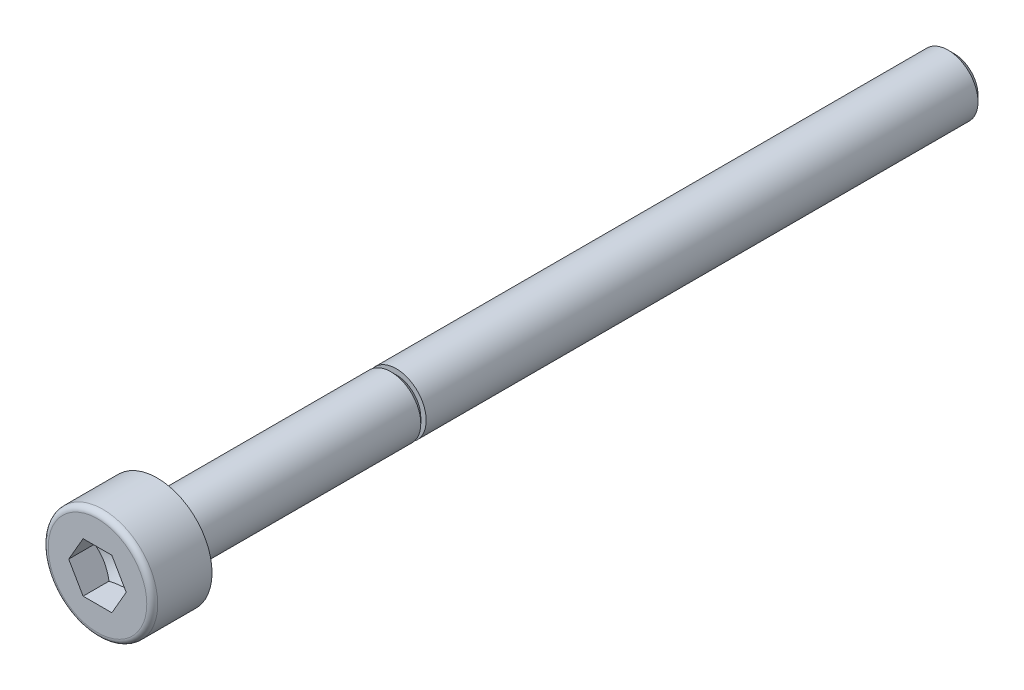
ISO-10303-21;
HEADER;
FILE_DESCRIPTION(('STEP AP214'),'2;1');
FILE_NAME('part.step','',(''),(''),'','','');
FILE_SCHEMA(('AUTOMOTIVE_DESIGN { 1 0 10303 214 1 1 1 1 }'));
ENDSEC;
DATA;
#1=APPLICATION_CONTEXT('core data for automotive mechanical design processes');
#2=APPLICATION_PROTOCOL_DEFINITION('international standard','automotive_design',2000,#1);
#3=PRODUCT_CONTEXT('',#1,'mechanical');
#4=PRODUCT('Part','Part','',(#3));
#5=PRODUCT_RELATED_PRODUCT_CATEGORY('part','',(#4));
#6=PRODUCT_DEFINITION_FORMATION('','',#4);
#7=PRODUCT_DEFINITION_CONTEXT('part definition',#1,'design');
#8=PRODUCT_DEFINITION('design','',#6,#7);
#9=PRODUCT_DEFINITION_SHAPE('','',#8);
#10=(LENGTH_UNIT() NAMED_UNIT(*) SI_UNIT(.MILLI.,.METRE.));
#11=(NAMED_UNIT(*) PLANE_ANGLE_UNIT() SI_UNIT($,.RADIAN.));
#12=(NAMED_UNIT(*) SI_UNIT($,.STERADIAN.) SOLID_ANGLE_UNIT());
#13=UNCERTAINTY_MEASURE_WITH_UNIT(LENGTH_MEASURE(1.E-05),#10,'distance_accuracy_value','');
#14=(GEOMETRIC_REPRESENTATION_CONTEXT(3) GLOBAL_UNCERTAINTY_ASSIGNED_CONTEXT((#13)) GLOBAL_UNIT_ASSIGNED_CONTEXT((#10,
#11,#12)) REPRESENTATION_CONTEXT('',''));
#15=CARTESIAN_POINT('',(0.,0.,0.));
#16=DIRECTION('',(0.,0.,1.));
#17=DIRECTION('',(1.,0.,0.));
#18=AXIS2_PLACEMENT_3D('',#15,#16,#17);
#19=CARTESIAN_POINT('',(0.,2.475,3.));
#20=DIRECTION('',(0.,0.,-1.));
#21=DIRECTION('',(-1.,0.,0.));
#22=AXIS2_PLACEMENT_3D('',#19,#20,#21);
#23=PLANE('',#22);
#24=CARTESIAN_POINT('',(0.,0.,3.));
#25=DIRECTION('',(0.,0.,1.));
#26=DIRECTION('',(1.,0.,0.));
#27=AXIS2_PLACEMENT_3D('',#24,#25,#26);
#28=CIRCLE('',#27,2.475);
#29=CARTESIAN_POINT('',(2.475,0.,3.));
#30=VERTEX_POINT('',#29);
#31=EDGE_CURVE('E148',#30,#30,#28,.T.);
#32=ORIENTED_EDGE('',*,*,#31,.T.);
#33=EDGE_LOOP('',(#32));
#34=FACE_BOUND('',#33,.T.);
#35=DIRECTION('',(0.5,-0.866025403784439,0.));
#36=VECTOR('',#35,1.);
#37=CARTESIAN_POINT('',(0.7216875,1.24999941718736,3.));
#38=LINE('',#37,#36);
#39=CARTESIAN_POINT('',(0.7216875,1.24999941718736,3.));
#40=VERTEX_POINT('',#39);
#41=CARTESIAN_POINT('',(1.443375,0.,3.));
#42=VERTEX_POINT('',#41);
#43=EDGE_CURVE('E50',#40,#42,#38,.T.);
#44=ORIENTED_EDGE('',*,*,#43,.T.);
#45=DIRECTION('',(-0.5,-0.866025403784439,0.));
#46=VECTOR('',#45,1.);
#47=CARTESIAN_POINT('',(1.443375,0.,3.));
#48=LINE('',#47,#46);
#49=CARTESIAN_POINT('',(0.7216875,-1.24999941718736,3.));
#50=VERTEX_POINT('',#49);
#51=EDGE_CURVE('E224',#42,#50,#48,.T.);
#52=ORIENTED_EDGE('',*,*,#51,.T.);
#53=DIRECTION('',(-1.,0.,0.));
#54=VECTOR('',#53,1.);
#55=CARTESIAN_POINT('',(0.7216875,-1.24999941718736,3.));
#56=LINE('',#55,#54);
#57=CARTESIAN_POINT('',(-0.7216875,-1.24999941718736,3.));
#58=VERTEX_POINT('',#57);
#59=EDGE_CURVE('E278',#50,#58,#56,.T.);
#60=ORIENTED_EDGE('',*,*,#59,.T.);
#61=DIRECTION('',(-0.5,0.866025403784439,0.));
#62=VECTOR('',#61,1.);
#63=CARTESIAN_POINT('',(-0.7216875,-1.24999941718736,3.));
#64=LINE('',#63,#62);
#65=CARTESIAN_POINT('',(-1.443375,0.,3.));
#66=VERTEX_POINT('',#65);
#67=EDGE_CURVE('E273',#58,#66,#64,.T.);
#68=ORIENTED_EDGE('',*,*,#67,.T.);
#69=DIRECTION('',(0.5,0.866025403784439,0.));
#70=VECTOR('',#69,1.);
#71=CARTESIAN_POINT('',(-1.443375,0.,3.));
#72=LINE('',#71,#70);
#73=CARTESIAN_POINT('',(-0.7216875,1.24999941718736,3.));
#74=VERTEX_POINT('',#73);
#75=EDGE_CURVE('E122',#66,#74,#72,.T.);
#76=ORIENTED_EDGE('',*,*,#75,.T.);
#77=DIRECTION('',(1.,0.,0.));
#78=VECTOR('',#77,1.);
#79=CARTESIAN_POINT('',(-0.7216875,1.24999941718736,3.));
#80=LINE('',#79,#78);
#81=EDGE_CURVE('E114',#74,#40,#80,.T.);
#82=ORIENTED_EDGE('',*,*,#81,.T.);
#83=EDGE_LOOP('',(#44,#52,#60,#68,#76,#82));
#84=FACE_BOUND('',#83,.T.);
#85=ADVANCED_FACE('F35',(#34,#84),#23,.F.);
#86=CARTESIAN_POINT('',(0.,0.,0.));
#87=DIRECTION('',(0.,0.,1.));
#88=DIRECTION('',(1.,0.,0.));
#89=AXIS2_PLACEMENT_3D('',#86,#87,#88);
#90=PLANE('',#89);
#91=CARTESIAN_POINT('',(0.,0.,0.));
#92=DIRECTION('',(0.,0.,1.));
#93=DIRECTION('',(1.,0.,0.));
#94=AXIS2_PLACEMENT_3D('',#91,#92,#93);
#95=CIRCLE('',#94,2.75);
#96=CARTESIAN_POINT('',(2.75,0.,0.));
#97=VERTEX_POINT('',#96);
#98=EDGE_CURVE('E156',#97,#97,#95,.T.);
#99=ORIENTED_EDGE('',*,*,#98,.F.);
#100=EDGE_LOOP('',(#99));
#101=FACE_BOUND('',#100,.T.);
#102=CARTESIAN_POINT('',(0.,0.,0.));
#103=DIRECTION('',(0.,0.,1.));
#104=DIRECTION('',(1.,0.,0.));
#105=AXIS2_PLACEMENT_3D('',#102,#103,#104);
#106=CIRCLE('',#105,1.5);
#107=CARTESIAN_POINT('',(1.5,0.,0.));
#108=VERTEX_POINT('',#107);
#109=EDGE_CURVE('E160',#108,#108,#106,.F.);
#110=ORIENTED_EDGE('',*,*,#109,.F.);
#111=EDGE_LOOP('',(#110));
#112=FACE_BOUND('',#111,.T.);
#113=ADVANCED_FACE('F178',(#101,#112),#90,.F.);
#114=CARTESIAN_POINT('',(0.,0.,3.));
#115=DIRECTION('',(0.,0.,1.));
#116=DIRECTION('',(1.,0.,0.));
#117=AXIS2_PLACEMENT_3D('',#114,#115,#116);
#118=CYLINDRICAL_SURFACE('',#117,2.75);
#119=CARTESIAN_POINT('',(0.,0.,2.725));
#120=DIRECTION('',(0.,0.,1.));
#121=DIRECTION('',(1.,0.,0.));
#122=AXIS2_PLACEMENT_3D('',#119,#120,#121);
#123=CIRCLE('',#122,2.75);
#124=CARTESIAN_POINT('',(2.75,0.,2.725));
#125=VERTEX_POINT('',#124);
#126=EDGE_CURVE('E152',#125,#125,#123,.T.);
#127=ORIENTED_EDGE('',*,*,#126,.F.);
#128=EDGE_LOOP('',(#127));
#129=FACE_BOUND('',#128,.T.);
#130=ORIENTED_EDGE('',*,*,#98,.T.);
#131=EDGE_LOOP('',(#130));
#132=FACE_BOUND('',#131,.T.);
#133=ADVANCED_FACE('F183',(#129,#132),#118,.T.);
#134=CARTESIAN_POINT('',(0.,0.,2.725));
#135=DIRECTION('',(0.,0.,1.));
#136=DIRECTION('',(1.,0.,0.));
#137=AXIS2_PLACEMENT_3D('',#134,#135,#136);
#138=TOROIDAL_SURFACE('',#137,2.475,0.275);
#139=ORIENTED_EDGE('',*,*,#31,.F.);
#140=EDGE_LOOP('',(#139));
#141=FACE_BOUND('',#140,.T.);
#142=ORIENTED_EDGE('',*,*,#126,.T.);
#143=EDGE_LOOP('',(#142));
#144=FACE_BOUND('',#143,.T.);
#145=ADVANCED_FACE('F190',(#141,#144),#138,.T.);
#146=CARTESIAN_POINT('',(0.,0.,0.));
#147=DIRECTION('',(0.,0.,1.));
#148=DIRECTION('',(1.,0.,0.));
#149=AXIS2_PLACEMENT_3D('',#146,#147,#148);
#150=CYLINDRICAL_SURFACE('',#149,1.5);
#151=CARTESIAN_POINT('',(0.,0.,-11.729375));
#152=DIRECTION('',(0.,0.,1.));
#153=DIRECTION('',(1.,0.,0.));
#154=AXIS2_PLACEMENT_3D('',#151,#152,#153);
#155=CIRCLE('',#154,1.5);
#156=CARTESIAN_POINT('',(1.5,0.,-11.729375));
#157=VERTEX_POINT('',#156);
#158=EDGE_CURVE('E136',#157,#157,#155,.T.);
#159=ORIENTED_EDGE('',*,*,#158,.T.);
#160=EDGE_LOOP('',(#159));
#161=FACE_BOUND('',#160,.T.);
#162=ORIENTED_EDGE('',*,*,#109,.T.);
#163=EDGE_LOOP('',(#162));
#164=FACE_BOUND('',#163,.T.);
#165=ADVANCED_FACE('F194',(#161,#164),#150,.T.);
#166=CARTESIAN_POINT('',(0.,0.,0.));
#167=DIRECTION('',(0.,0.,1.));
#168=DIRECTION('',(1.,0.,0.));
#169=AXIS2_PLACEMENT_3D('',#166,#167,#168);
#170=CYLINDRICAL_SURFACE('',#169,1.5);
#171=CARTESIAN_POINT('',(0.,0.,-39.7));
#172=DIRECTION('',(0.,0.,1.));
#173=DIRECTION('',(1.,0.,0.));
#174=AXIS2_PLACEMENT_3D('',#171,#172,#173);
#175=CIRCLE('',#174,1.5);
#176=CARTESIAN_POINT('',(1.5,0.,-39.7));
#177=VERTEX_POINT('',#176);
#178=EDGE_CURVE('E43',#177,#177,#175,.T.);
#179=ORIENTED_EDGE('',*,*,#178,.T.);
#180=EDGE_LOOP('',(#179));
#181=FACE_BOUND('',#180,.T.);
#182=CARTESIAN_POINT('',(0.,0.,-12.));
#183=DIRECTION('',(0.,0.,1.));
#184=DIRECTION('',(1.,0.,0.));
#185=AXIS2_PLACEMENT_3D('',#182,#183,#184);
#186=CIRCLE('',#185,1.5);
#187=CARTESIAN_POINT('',(1.5,0.,-12.));
#188=VERTEX_POINT('',#187);
#189=EDGE_CURVE('E144',#188,#188,#186,.T.);
#190=ORIENTED_EDGE('',*,*,#189,.F.);
#191=EDGE_LOOP('',(#190));
#192=FACE_BOUND('',#191,.T.);
#193=ADVANCED_FACE('F166',(#181,#192),#170,.T.);
#194=CARTESIAN_POINT('',(0.,1.5,-12.));
#195=DIRECTION('',(0.,0.,-1.));
#196=DIRECTION('',(-1.,0.,0.));
#197=AXIS2_PLACEMENT_3D('',#194,#195,#196);
#198=PLANE('',#197);
#199=CARTESIAN_POINT('',(0.,0.,-12.));
#200=DIRECTION('',(0.,0.,1.));
#201=DIRECTION('',(1.,0.,0.));
#202=AXIS2_PLACEMENT_3D('',#199,#200,#201);
#203=CIRCLE('',#202,1.229375);
#204=CARTESIAN_POINT('',(1.229375,0.,-12.));
#205=VERTEX_POINT('',#204);
#206=EDGE_CURVE('E140',#205,#205,#203,.T.);
#207=ORIENTED_EDGE('',*,*,#206,.F.);
#208=EDGE_LOOP('',(#207));
#209=FACE_BOUND('',#208,.T.);
#210=ORIENTED_EDGE('',*,*,#189,.T.);
#211=EDGE_LOOP('',(#210));
#212=FACE_BOUND('',#211,.T.);
#213=ADVANCED_FACE('F198',(#209,#212),#198,.F.);
#214=CARTESIAN_POINT('',(0.,0.,-12.));
#215=DIRECTION('',(0.,0.,1.));
#216=DIRECTION('',(1.,0.,0.));
#217=AXIS2_PLACEMENT_3D('',#214,#215,#216);
#218=CONICAL_SURFACE('',#217,1.229375,0.785398163397449);
#219=ORIENTED_EDGE('',*,*,#158,.F.);
#220=EDGE_LOOP('',(#219));
#221=FACE_BOUND('',#220,.T.);
#222=ORIENTED_EDGE('',*,*,#206,.T.);
#223=EDGE_LOOP('',(#222));
#224=FACE_BOUND('',#223,.T.);
#225=ADVANCED_FACE('F201',(#221,#224),#218,.T.);
#226=CARTESIAN_POINT('',(0.7216875,1.24999941718736,0.866667055208424));
#227=DIRECTION('',(-0.866025403784439,-0.5,0.));
#228=DIRECTION('',(-0.5,0.866025403784439,0.));
#229=AXIS2_PLACEMENT_3D('',#226,#227,#228);
#230=PLANE('',#229);
#231=DIRECTION('',(0.,0.,1.));
#232=VECTOR('',#231,1.);
#233=CARTESIAN_POINT('',(1.443375,0.,0.866667055208424));
#234=LINE('',#233,#232);
#235=CARTESIAN_POINT('',(1.443375,0.,1.7));
#236=VERTEX_POINT('',#235);
#237=EDGE_CURVE('E134',#236,#42,#234,.T.);
#238=ORIENTED_EDGE('',*,*,#237,.T.);
#239=ORIENTED_EDGE('',*,*,#43,.F.);
#240=DIRECTION('',(0.,0.,1.));
#241=VECTOR('',#240,1.);
#242=CARTESIAN_POINT('',(0.7216875,1.24999941718736,0.866667055208424));
#243=LINE('',#242,#241);
#244=CARTESIAN_POINT('',(0.7216875,1.24999941718736,1.7));
#245=VERTEX_POINT('',#244);
#246=EDGE_CURVE('E107',#245,#40,#243,.T.);
#247=ORIENTED_EDGE('',*,*,#246,.F.);
#248=CARTESIAN_POINT('',(1.44337615470054,-2.E-06,1.70000066666746));
#249=CARTESIAN_POINT('',(1.41166234028678,0.0549279378664336,1.68168533615401));
#250=CARTESIAN_POINT('',(1.37967477272109,0.110332030100754,1.665028493242));
#251=CARTESIAN_POINT('',(1.31514579266581,0.222099502117096,1.63595445502155));
#252=CARTESIAN_POINT('',(1.28260323398259,0.278464867164723,1.62354754391631));
#253=CARTESIAN_POINT('',(1.2179214008177,0.39049708853301,1.60423526604097));
#254=CARTESIAN_POINT('',(1.18579207575664,0.446146711951657,1.59720135081684));
#255=CARTESIAN_POINT('',(1.12138232312734,0.557707676008561,1.58880584887112));
#256=CARTESIAN_POINT('',(1.08910212951503,0.613618611423235,1.5874373083282));
#257=CARTESIAN_POINT('',(1.02878989848834,0.718082459879303,1.59029140151107));
#258=CARTESIAN_POINT('',(1.00074881136366,0.766651047478699,1.59381326069777));
#259=CARTESIAN_POINT('',(0.94484931590916,0.863471813723365,1.60497329524828));
#260=CARTESIAN_POINT('',(0.916991100780736,0.91172365773398,1.61261527923588));
#261=CARTESIAN_POINT('',(0.860976444321451,1.00874388868998,1.63171878575366));
#262=CARTESIAN_POINT('',(0.832827088932361,1.0575000024242,1.64326125012845));
#263=CARTESIAN_POINT('',(0.776948107685497,1.15428523701895,1.6694577743606));
#264=CARTESIAN_POINT('',(0.749217766489108,1.20231559688232,1.68410568290989));
#265=CARTESIAN_POINT('',(0.721686345299461,1.25000141718736,1.70000066666746));
#266=B_SPLINE_CURVE_WITH_KNOTS('',3,(#248,#249,#250,#251,#252,#253,#254,#255,#256,#257,#258,
#259,#260,#261,#262,#263,#264,#265),.UNSPECIFIED.,.F.,.F.,(4,2,2,2,2,2,2,2,4),(0.,
0.198135072963001,0.396746271230005,0.590442442133857,0.783900794935013,0.952318546997791,
1.12089225123217,1.29320414395206,1.46517785562982),.UNSPECIFIED.);
#267=EDGE_CURVE('E99',#236,#245,#266,.T.);
#268=ORIENTED_EDGE('',*,*,#267,.F.);
#269=EDGE_LOOP('',(#238,#239,#247,#268));
#270=FACE_BOUND('',#269,.T.);
#271=ADVANCED_FACE('F108',(#270),#230,.T.);
#272=CARTESIAN_POINT('',(1.443375,0.,0.866667055208424));
#273=DIRECTION('',(-0.866025403784439,0.5,0.));
#274=DIRECTION('',(0.5,0.866025403784439,0.));
#275=AXIS2_PLACEMENT_3D('',#272,#273,#274);
#276=PLANE('',#275);
#277=DIRECTION('',(0.,0.,1.));
#278=VECTOR('',#277,1.);
#279=CARTESIAN_POINT('',(0.7216875,-1.24999941718736,0.866667055208424));
#280=LINE('',#279,#278);
#281=CARTESIAN_POINT('',(0.7216875,-1.24999941718736,1.7));
#282=VERTEX_POINT('',#281);
#283=EDGE_CURVE('E131',#282,#50,#280,.T.);
#284=ORIENTED_EDGE('',*,*,#283,.T.);
#285=ORIENTED_EDGE('',*,*,#51,.F.);
#286=ORIENTED_EDGE('',*,*,#237,.F.);
#287=CARTESIAN_POINT('',(0.721686345299462,-1.25000141718736,1.70000066666746));
#288=CARTESIAN_POINT('',(0.753400159713217,-1.19507147932093,1.68168533615401));
#289=CARTESIAN_POINT('',(0.785387727278908,-1.13966738708661,1.665028493242));
#290=CARTESIAN_POINT('',(0.849916707334187,-1.02789991507027,1.63595445502155));
#291=CARTESIAN_POINT('',(0.882459266017406,-0.971534550022641,1.62354754391631));
#292=CARTESIAN_POINT('',(0.947141099182298,-0.859502328654354,1.60423526604097));
#293=CARTESIAN_POINT('',(0.979270424243356,-0.803852705235707,1.59720135081684));
#294=CARTESIAN_POINT('',(1.04368017687266,-0.692291741178803,1.58880584887112));
#295=CARTESIAN_POINT('',(1.07596037048497,-0.63638080576413,1.5874373083282));
#296=CARTESIAN_POINT('',(1.13627260151166,-0.531916957308062,1.59029140151107));
#297=CARTESIAN_POINT('',(1.16431368863634,-0.483348369708666,1.59381326069777));
#298=CARTESIAN_POINT('',(1.22021318409084,-0.386527603463999,1.60497329524828));
#299=CARTESIAN_POINT('',(1.24807139921926,-0.338275759453385,1.61261527923588));
#300=CARTESIAN_POINT('',(1.30408605567855,-0.241255528497386,1.63171878575366));
#301=CARTESIAN_POINT('',(1.33223541106764,-0.192499414763169,1.64326125012845));
#302=CARTESIAN_POINT('',(1.3881143923145,-0.0957141801684128,1.6694577743606));
#303=CARTESIAN_POINT('',(1.41584473351089,-0.0476838203050465,1.68410568290989));
#304=CARTESIAN_POINT('',(1.44337615470054,1.99999999983435E-06,1.70000066666746));
#305=B_SPLINE_CURVE_WITH_KNOTS('',3,(#287,#288,#289,#290,#291,#292,#293,#294,#295,#296,#297,
#298,#299,#300,#301,#302,#303,#304),.UNSPECIFIED.,.F.,.F.,(4,2,2,2,2,2,2,2,4),(0.,
0.198135072963001,0.396746271230005,0.590442442133857,0.783900794935012,0.95231854699779,
1.12089225123217,1.29320414395206,1.46517785562982),.UNSPECIFIED.);
#306=EDGE_CURVE('E103',#282,#236,#305,.T.);
#307=ORIENTED_EDGE('',*,*,#306,.F.);
#308=EDGE_LOOP('',(#284,#285,#286,#307));
#309=FACE_BOUND('',#308,.T.);
#310=ADVANCED_FACE('F212',(#309),#276,.T.);
#311=CARTESIAN_POINT('',(0.7216875,-1.24999941718736,0.866667055208424));
#312=DIRECTION('',(0.,1.,0.));
#313=DIRECTION('',(1.,0.,0.));
#314=AXIS2_PLACEMENT_3D('',#311,#312,#313);
#315=PLANE('',#314);
#316=DIRECTION('',(0.,0.,1.));
#317=VECTOR('',#316,1.);
#318=CARTESIAN_POINT('',(-0.7216875,-1.24999941718736,0.866667055208424));
#319=LINE('',#318,#317);
#320=CARTESIAN_POINT('',(-0.7216875,-1.24999941718736,1.7));
#321=VERTEX_POINT('',#320);
#322=EDGE_CURVE('E128',#321,#58,#319,.T.);
#323=ORIENTED_EDGE('',*,*,#322,.T.);
#324=ORIENTED_EDGE('',*,*,#59,.F.);
#325=ORIENTED_EDGE('',*,*,#283,.F.);
#326=CARTESIAN_POINT('',(-1.86893053107489,-1.24999941718736,2.16479389453662));
#327=CARTESIAN_POINT('',(-1.81495117776836,-1.24999941718736,2.13889663446086));
#328=CARTESIAN_POINT('',(-1.76084043441986,-1.24999941718736,2.11326843017583));
#329=CARTESIAN_POINT('',(-1.65228585942289,-1.24999941718736,2.06270259301794));
#330=CARTESIAN_POINT('',(-1.59784196995446,-1.24999941718736,2.03776508442438));
#331=CARTESIAN_POINT('',(-1.48823862830604,-1.24999941718736,1.98859378412848));
#332=CARTESIAN_POINT('',(-1.43307683885742,-1.24999941718736,1.964365178818));
#333=CARTESIAN_POINT('',(-1.32229127521218,-1.24999941718736,1.91699497239768));
#334=CARTESIAN_POINT('',(-1.26666752521415,-1.24999941718736,1.89385331476833));
#335=CARTESIAN_POINT('',(-1.15340030068293,-1.24999941718736,1.84835454701775));
#336=CARTESIAN_POINT('',(-1.09574203904477,-1.24999941718736,1.82603375946839));
#337=CARTESIAN_POINT('',(-0.979740631963517,-1.24999941718736,1.7832554401815));
#338=CARTESIAN_POINT('',(-0.921397401730977,-1.24999941718736,1.76279814192238));
#339=CARTESIAN_POINT('',(-0.745435180245369,-1.24999941718736,1.7050842361654));
#340=CARTESIAN_POINT('',(-0.626561647576072,-1.24999941718736,1.6713502286798));
#341=CARTESIAN_POINT('',(-0.445872875814715,-1.24999941718736,1.63222043843359));
#342=CARTESIAN_POINT('',(-0.385304520505474,-1.24999941718736,1.62109409740059));
#343=CARTESIAN_POINT('',(-0.263486469039549,-1.24999941718736,1.60342789727153));
#344=CARTESIAN_POINT('',(-0.20223681921018,-1.24999941718736,1.59688772823406));
#345=CARTESIAN_POINT('',(-0.0801324091719259,-1.24999941718736,1.58899883278388));
#346=CARTESIAN_POINT('',(-0.0192817104364654,-1.24999941718736,1.58758884366631));
#347=CARTESIAN_POINT('',(0.102319185361569,-1.24999941718736,1.58991623923036));
#348=CARTESIAN_POINT('',(0.163069375967905,-1.24999941718736,1.59365394263641));
#349=CARTESIAN_POINT('',(0.312961455362286,-1.24999941718736,1.60889807076613));
#350=CARTESIAN_POINT('',(0.40181287263432,-1.24999941718736,1.62326128492051));
#351=CARTESIAN_POINT('',(0.577787885436386,-1.24999941718736,1.66029986996745));
#352=CARTESIAN_POINT('',(0.664909264565296,-1.24999941718736,1.6829852590032));
#353=CARTESIAN_POINT('',(0.795208864990653,-1.24999941718736,1.72173744658089));
#354=CARTESIAN_POINT('',(0.839060620655932,-1.24999941718736,1.73562293145017));
#355=CARTESIAN_POINT('',(0.926307663712636,-1.24999941718736,1.76467838801274));
#356=CARTESIAN_POINT('',(0.969703217226752,-1.24999941718736,1.77984755808705));
#357=CARTESIAN_POINT('',(1.05609584795378,-1.24999941718736,1.81125008410185));
#358=CARTESIAN_POINT('',(1.09909299597128,-1.24999941718736,1.82748324664252));
#359=CARTESIAN_POINT('',(1.18474848915208,-1.24999941718736,1.86083816989018));
#360=CARTESIAN_POINT('',(1.22740677566046,-1.24999941718736,1.87796008072948));
#361=CARTESIAN_POINT('',(1.33629337906013,-1.24999941718736,1.92276108125511));
#362=CARTESIAN_POINT('',(1.40230397627437,-1.24999941718736,1.95096876212353));
#363=CARTESIAN_POINT('',(1.53372907463052,-1.24999941718736,2.00874389121968));
#364=CARTESIAN_POINT('',(1.59914353067598,-1.24999941718736,2.03831144131143));
#365=CARTESIAN_POINT('',(1.79469131828896,-1.24999941718736,2.12857452862346));
#366=CARTESIAN_POINT('',(1.92410722703437,-1.24999941718736,2.19082124932175));
#367=CARTESIAN_POINT('',(2.18183340208154,-1.24999941718736,2.31792530727724));
#368=CARTESIAN_POINT('',(2.31014211360569,-1.24999941718736,2.3827857597699));
#369=CARTESIAN_POINT('',(2.565880437641,-1.24999941718736,2.51417443954414));
#370=CARTESIAN_POINT('',(2.69331015929244,-1.24999941718736,2.58070245483918));
#371=CARTESIAN_POINT('',(2.93556233058972,-1.24999941718736,2.70857379582091));
#372=CARTESIAN_POINT('',(3.05043950275986,-1.24999941718736,2.76981380943349));
#373=CARTESIAN_POINT('',(3.27982431975772,-1.24999941718736,2.89299160700423));
#374=CARTESIAN_POINT('',(3.39433195070739,-1.24999941718736,2.95492941678458));
#375=CARTESIAN_POINT('',(3.62277162051502,-1.24999941718736,3.07916961449806));
#376=CARTESIAN_POINT('',(3.73670438259663,-1.24999941718736,3.14147067442078));
#377=CARTESIAN_POINT('',(3.96433956104116,-1.24999941718736,3.26647828608533));
#378=CARTESIAN_POINT('',(4.07804198914647,-1.24999941718736,3.32918481643642));
#379=CARTESIAN_POINT('',(4.19166166337244,-1.24999941718736,3.39204003381013));
#380=B_SPLINE_CURVE_WITH_KNOTS('',3,(#326,#327,#328,#329,#330,#331,#332,#333,#334,#335,#336,
#337,#338,#339,#340,#341,#342,#343,#344,#345,#346,#347,#348,#349,#350,#351,#352,#353,#354,#355,
#356,#357,#358,#359,#360,#361,#362,#363,#364,#365,#366,#367,#368,#369,#370,#371,#372,#373,#374,
#375,#376,#377,#378,#379),.UNSPECIFIED.,.F.,.F.,(4,2,2,2,2,2,2,2,2,2,2,2,2,2,2,2,2,2,2,2,2,2,2,
2,2,2,4),(0.,0.179612840817485,0.359257792773138,0.539992477393523,0.72071775367729,
0.906167353114828,1.09164015584897,1.46153946542598,1.64614477745769,1.83073761234132,
2.01311873652213,2.1955111535168,2.46497183475509,2.73475795996105,2.87273569413166,
3.01062789275234,3.14849509611698,3.28638566505407,3.50171816734966,3.71706682595868,
4.14783526963883,4.57913326931211,5.01037671616215,5.40091711572386,5.79147201515411,
6.18103353481212,6.57057466801426),.UNSPECIFIED.);
#381=EDGE_CURVE('E249',#321,#282,#380,.T.);
#382=ORIENTED_EDGE('',*,*,#381,.F.);
#383=EDGE_LOOP('',(#323,#324,#325,#382));
#384=FACE_BOUND('',#383,.T.);
#385=ADVANCED_FACE('F254',(#384),#315,.T.);
#386=CARTESIAN_POINT('',(-0.7216875,-1.24999941718736,0.866667055208424));
#387=DIRECTION('',(0.866025403784439,0.5,0.));
#388=DIRECTION('',(0.5,-0.866025403784439,0.));
#389=AXIS2_PLACEMENT_3D('',#386,#387,#388);
#390=PLANE('',#389);
#391=DIRECTION('',(0.,0.,1.));
#392=VECTOR('',#391,1.);
#393=CARTESIAN_POINT('',(-1.443375,0.,0.866667055208424));
#394=LINE('',#393,#392);
#395=CARTESIAN_POINT('',(-1.443375,0.,1.7));
#396=VERTEX_POINT('',#395);
#397=EDGE_CURVE('E119',#396,#66,#394,.T.);
#398=ORIENTED_EDGE('',*,*,#397,.T.);
#399=ORIENTED_EDGE('',*,*,#67,.F.);
#400=ORIENTED_EDGE('',*,*,#322,.F.);
#401=CARTESIAN_POINT('',(-1.44337615470054,2.00000000041633E-06,1.70000066666746));
#402=CARTESIAN_POINT('',(-1.41166234028678,-0.0549279378664328,1.68168533615401));
#403=CARTESIAN_POINT('',(-1.37967477272109,-0.110332030100753,1.665028493242));
#404=CARTESIAN_POINT('',(-1.31514579266581,-0.222099502117095,1.63595445502155));
#405=CARTESIAN_POINT('',(-1.28260323398259,-0.278464867164722,1.62354754391631));
#406=CARTESIAN_POINT('',(-1.2179214008177,-0.390497088533009,1.60423526604097));
#407=CARTESIAN_POINT('',(-1.18579207575664,-0.446146711951656,1.59720135081684));
#408=CARTESIAN_POINT('',(-1.12138232312734,-0.55770767600856,1.58880584887112));
#409=CARTESIAN_POINT('',(-1.08910212951503,-0.613618611423234,1.5874373083282));
#410=CARTESIAN_POINT('',(-1.02878989848834,-0.718082459879302,1.59029140151107));
#411=CARTESIAN_POINT('',(-1.00074881136366,-0.766651047478698,1.59381326069777));
#412=CARTESIAN_POINT('',(-0.944849315909161,-0.863471813723365,1.60497329524827));
#413=CARTESIAN_POINT('',(-0.916991100780737,-0.911723657733979,1.61261527923588));
#414=CARTESIAN_POINT('',(-0.860976444321451,-1.00874388868998,1.63171878575366));
#415=CARTESIAN_POINT('',(-0.832827088932361,-1.0575000024242,1.64326125012845));
#416=CARTESIAN_POINT('',(-0.776948107685497,-1.15428523701895,1.6694577743606));
#417=CARTESIAN_POINT('',(-0.749217766489108,-1.20231559688232,1.68410568290989));
#418=CARTESIAN_POINT('',(-0.721686345299461,-1.25000141718736,1.70000066666746));
#419=B_SPLINE_CURVE_WITH_KNOTS('',3,(#401,#402,#403,#404,#405,#406,#407,#408,#409,#410,#411,
#412,#413,#414,#415,#416,#417,#418),.UNSPECIFIED.,.F.,.F.,(4,2,2,2,2,2,2,2,4),(0.,
0.198135072963001,0.396746271230005,0.590442442133858,0.783900794935013,0.952318546997791,
1.12089225123217,1.29320414395206,1.46517785562982),.UNSPECIFIED.);
#420=EDGE_CURVE('E244',#396,#321,#419,.T.);
#421=ORIENTED_EDGE('',*,*,#420,.F.);
#422=EDGE_LOOP('',(#398,#399,#400,#421));
#423=FACE_BOUND('',#422,.T.);
#424=ADVANCED_FACE('F257',(#423),#390,.T.);
#425=CARTESIAN_POINT('',(-1.443375,0.,0.866667055208424));
#426=DIRECTION('',(0.866025403784439,-0.5,0.));
#427=DIRECTION('',(-0.5,-0.866025403784439,0.));
#428=AXIS2_PLACEMENT_3D('',#425,#426,#427);
#429=PLANE('',#428);
#430=DIRECTION('',(0.,0.,1.));
#431=VECTOR('',#430,1.);
#432=CARTESIAN_POINT('',(-0.7216875,1.24999941718736,0.866667055208424));
#433=LINE('',#432,#431);
#434=CARTESIAN_POINT('',(-0.7216875,1.24999941718736,1.7));
#435=VERTEX_POINT('',#434);
#436=EDGE_CURVE('E113',#435,#74,#433,.T.);
#437=ORIENTED_EDGE('',*,*,#436,.T.);
#438=ORIENTED_EDGE('',*,*,#75,.F.);
#439=ORIENTED_EDGE('',*,*,#397,.F.);
#440=CARTESIAN_POINT('',(-0.721686345299462,1.25000141718736,1.70000066666746));
#441=CARTESIAN_POINT('',(-0.753400159713217,1.19507147932093,1.68168533615401));
#442=CARTESIAN_POINT('',(-0.785387727278908,1.13966738708661,1.665028493242));
#443=CARTESIAN_POINT('',(-0.849916707334187,1.02789991507027,1.63595445502155));
#444=CARTESIAN_POINT('',(-0.882459266017407,0.971534550022641,1.62354754391631));
#445=CARTESIAN_POINT('',(-0.947141099182298,0.859502328654354,1.60423526604097));
#446=CARTESIAN_POINT('',(-0.979270424243356,0.803852705235707,1.59720135081684));
#447=CARTESIAN_POINT('',(-1.04368017687266,0.692291741178803,1.58880584887112));
#448=CARTESIAN_POINT('',(-1.07596037048497,0.636380805764129,1.5874373083282));
#449=CARTESIAN_POINT('',(-1.13627260151166,0.531916957308061,1.59029140151107));
#450=CARTESIAN_POINT('',(-1.16431368863634,0.483348369708665,1.59381326069777));
#451=CARTESIAN_POINT('',(-1.22021318409084,0.386527603463999,1.60497329524828));
#452=CARTESIAN_POINT('',(-1.24807139921926,0.338275759453385,1.61261527923588));
#453=CARTESIAN_POINT('',(-1.30408605567855,0.241255528497386,1.63171878575366));
#454=CARTESIAN_POINT('',(-1.33223541106764,0.192499414763169,1.64326125012845));
#455=CARTESIAN_POINT('',(-1.3881143923145,0.0957141801684129,1.6694577743606));
#456=CARTESIAN_POINT('',(-1.41584473351089,0.0476838203050468,1.68410568290989));
#457=CARTESIAN_POINT('',(-1.44337615470054,-1.99999999947233E-06,1.70000066666746));
#458=B_SPLINE_CURVE_WITH_KNOTS('',3,(#440,#441,#442,#443,#444,#445,#446,#447,#448,#449,#450,
#451,#452,#453,#454,#455,#456,#457),.UNSPECIFIED.,.F.,.F.,(4,2,2,2,2,2,2,2,4),(0.,
0.198135072963001,0.396746271230005,0.590442442133857,0.783900794935013,0.95231854699779,
1.12089225123217,1.29320414395206,1.46517785562982),.UNSPECIFIED.);
#459=EDGE_CURVE('E58',#435,#396,#458,.T.);
#460=ORIENTED_EDGE('',*,*,#459,.F.);
#461=EDGE_LOOP('',(#437,#438,#439,#460));
#462=FACE_BOUND('',#461,.T.);
#463=ADVANCED_FACE('F261',(#462),#429,.T.);
#464=CARTESIAN_POINT('',(-0.7216875,1.24999941718736,0.866667055208424));
#465=DIRECTION('',(0.,-1.,0.));
#466=DIRECTION('',(-1.,0.,0.));
#467=AXIS2_PLACEMENT_3D('',#464,#465,#466);
#468=PLANE('',#467);
#469=ORIENTED_EDGE('',*,*,#246,.T.);
#470=ORIENTED_EDGE('',*,*,#81,.F.);
#471=ORIENTED_EDGE('',*,*,#436,.F.);
#472=CARTESIAN_POINT('',(-1.86893053107489,1.24999941718736,2.16479389453662));
#473=CARTESIAN_POINT('',(-1.81495117776836,1.24999941718736,2.13889663446086));
#474=CARTESIAN_POINT('',(-1.76084043441986,1.24999941718736,2.11326843017583));
#475=CARTESIAN_POINT('',(-1.65228585942289,1.24999941718736,2.06270259301794));
#476=CARTESIAN_POINT('',(-1.59784196995446,1.24999941718736,2.03776508442438));
#477=CARTESIAN_POINT('',(-1.48823862830604,1.24999941718736,1.98859378412848));
#478=CARTESIAN_POINT('',(-1.43307683885742,1.24999941718736,1.964365178818));
#479=CARTESIAN_POINT('',(-1.32229127521218,1.24999941718736,1.91699497239768));
#480=CARTESIAN_POINT('',(-1.26666752521415,1.24999941718736,1.89385331476833));
#481=CARTESIAN_POINT('',(-1.15340030068293,1.24999941718736,1.84835454701775));
#482=CARTESIAN_POINT('',(-1.09574203904477,1.24999941718736,1.82603375946839));
#483=CARTESIAN_POINT('',(-0.979740631963517,1.24999941718736,1.7832554401815));
#484=CARTESIAN_POINT('',(-0.921397401730978,1.24999941718736,1.76279814192238));
#485=CARTESIAN_POINT('',(-0.745435180245369,1.24999941718736,1.7050842361654));
#486=CARTESIAN_POINT('',(-0.626561647576072,1.24999941718736,1.6713502286798));
#487=CARTESIAN_POINT('',(-0.445872875814715,1.24999941718736,1.63222043843359));
#488=CARTESIAN_POINT('',(-0.385304520505474,1.24999941718736,1.62109409740059));
#489=CARTESIAN_POINT('',(-0.263486469039549,1.24999941718736,1.60342789727153));
#490=CARTESIAN_POINT('',(-0.20223681921018,1.24999941718736,1.59688772823406));
#491=CARTESIAN_POINT('',(-0.0801324091719265,1.24999941718736,1.58899883278388));
#492=CARTESIAN_POINT('',(-0.0192817104364659,1.24999941718736,1.58758884366631));
#493=CARTESIAN_POINT('',(0.102319185361568,1.24999941718736,1.58991623923036));
#494=CARTESIAN_POINT('',(0.163069375967905,1.24999941718736,1.59365394263641));
#495=CARTESIAN_POINT('',(0.312961455362285,1.24999941718736,1.60889807076613));
#496=CARTESIAN_POINT('',(0.401812872634319,1.24999941718736,1.62326128492051));
#497=CARTESIAN_POINT('',(0.577787885436385,1.24999941718736,1.66029986996745));
#498=CARTESIAN_POINT('',(0.664909264565295,1.24999941718736,1.6829852590032));
#499=CARTESIAN_POINT('',(0.795208864990651,1.24999941718736,1.72173744658089));
#500=CARTESIAN_POINT('',(0.839060620655931,1.24999941718736,1.73562293145017));
#501=CARTESIAN_POINT('',(0.926307663712634,1.24999941718736,1.76467838801274));
#502=CARTESIAN_POINT('',(0.969703217226751,1.24999941718736,1.77984755808705));
#503=CARTESIAN_POINT('',(1.05609584795378,1.24999941718737,1.81125008410185));
#504=CARTESIAN_POINT('',(1.09909299597128,1.24999941718737,1.82748324664252));
#505=CARTESIAN_POINT('',(1.18474848915208,1.24999941718736,1.86083816989018));
#506=CARTESIAN_POINT('',(1.22740677566045,1.24999941718736,1.87796008072948));
#507=CARTESIAN_POINT('',(1.33629337906013,1.24999941718736,1.92276108125511));
#508=CARTESIAN_POINT('',(1.40230397627436,1.24999941718736,1.95096876212353));
#509=CARTESIAN_POINT('',(1.53372907463051,1.24999941718737,2.00874389121968));
#510=CARTESIAN_POINT('',(1.59914353067597,1.24999941718737,2.03831144131143));
#511=CARTESIAN_POINT('',(1.79469131828895,1.24999941718736,2.12857452862346));
#512=CARTESIAN_POINT('',(1.92410722703437,1.24999941718737,2.19082124932175));
#513=CARTESIAN_POINT('',(2.18183340208154,1.24999941718737,2.31792530727724));
#514=CARTESIAN_POINT('',(2.31014211360569,1.24999941718737,2.3827857597699));
#515=CARTESIAN_POINT('',(2.565880437641,1.24999941718737,2.51417443954414));
#516=CARTESIAN_POINT('',(2.69331015929244,1.24999941718737,2.58070245483918));
#517=CARTESIAN_POINT('',(2.93556233058972,1.24999941718737,2.70857379582091));
#518=CARTESIAN_POINT('',(3.05043950275985,1.24999941718737,2.76981380943349));
#519=CARTESIAN_POINT('',(3.27982431975771,1.24999941718737,2.89299160700422));
#520=CARTESIAN_POINT('',(3.39433195070738,1.24999941718737,2.95492941678457));
#521=CARTESIAN_POINT('',(3.62277162051502,1.24999941718737,3.07916961449806));
#522=CARTESIAN_POINT('',(3.73670438259662,1.24999941718737,3.14147067442078));
#523=CARTESIAN_POINT('',(3.96433956104115,1.24999941718737,3.26647828608533));
#524=CARTESIAN_POINT('',(4.07804198914646,1.24999941718737,3.32918481643642));
#525=CARTESIAN_POINT('',(4.19166166337243,1.24999941718737,3.39204003381013));
#526=B_SPLINE_CURVE_WITH_KNOTS('',3,(#472,#473,#474,#475,#476,#477,#478,#479,#480,#481,#482,
#483,#484,#485,#486,#487,#488,#489,#490,#491,#492,#493,#494,#495,#496,#497,#498,#499,#500,#501,
#502,#503,#504,#505,#506,#507,#508,#509,#510,#511,#512,#513,#514,#515,#516,#517,#518,#519,#520,
#521,#522,#523,#524,#525),.UNSPECIFIED.,.F.,.F.,(4,2,2,2,2,2,2,2,2,2,2,2,2,2,2,2,2,2,2,2,2,2,2,
2,2,2,4),(0.,0.179612840817484,0.359257792773138,0.539992477393523,0.72071775367729,
0.906167353114828,1.09164015584897,1.46153946542598,1.64614477745769,1.83073761234132,
2.01311873652213,2.1955111535168,2.46497183475509,2.73475795996105,2.87273569413165,
3.01062789275234,3.14849509611698,3.28638566505407,3.50171816734966,3.71706682595868,
4.14783526963883,4.5791332693121,5.01037671616214,5.40091711572385,5.7914720151541,
6.18103353481212,6.57057466801426),.UNSPECIFIED.);
#527=EDGE_CURVE('E100',#245,#435,#526,.F.);
#528=ORIENTED_EDGE('',*,*,#527,.F.);
#529=EDGE_LOOP('',(#469,#470,#471,#528));
#530=FACE_BOUND('',#529,.T.);
#531=ADVANCED_FACE('F95',(#530),#468,.T.);
#532=CARTESIAN_POINT('',(0.,0.,0.866667055208424));
#533=DIRECTION('',(0.,0.,1.));
#534=DIRECTION('',(1.,0.,0.));
#535=AXIS2_PLACEMENT_3D('',#532,#533,#534);
#536=CONICAL_SURFACE('',#535,0.,1.0471975511966);
#537=CARTESIAN_POINT('',(0.,0.,0.866667055208424));
#538=VERTEX_POINT('',#537);
#539=VERTEX_LOOP('',#538);
#540=FACE_BOUND('',#539,.T.);
#541=ORIENTED_EDGE('',*,*,#267,.T.);
#542=ORIENTED_EDGE('',*,*,#527,.T.);
#543=ORIENTED_EDGE('',*,*,#459,.T.);
#544=ORIENTED_EDGE('',*,*,#420,.T.);
#545=ORIENTED_EDGE('',*,*,#381,.T.);
#546=ORIENTED_EDGE('',*,*,#306,.T.);
#547=EDGE_LOOP('',(#541,#542,#543,#544,#545,#546));
#548=FACE_BOUND('',#547,.T.);
#549=ADVANCED_FACE('F91',(#540,#548),#536,.F.);
#550=CARTESIAN_POINT('',(0.,0.,-40.));
#551=DIRECTION('',(0.,0.,1.));
#552=DIRECTION('',(1.,0.,0.));
#553=AXIS2_PLACEMENT_3D('',#550,#551,#552);
#554=PLANE('',#553);
#555=CARTESIAN_POINT('',(0.,0.,-40.));
#556=DIRECTION('',(0.,0.,1.));
#557=DIRECTION('',(1.,0.,0.));
#558=AXIS2_PLACEMENT_3D('',#555,#556,#557);
#559=CIRCLE('',#558,1.19999999999999);
#560=CARTESIAN_POINT('',(1.19999999999999,0.,-40.));
#561=VERTEX_POINT('',#560);
#562=EDGE_CURVE('E12',#561,#561,#559,.F.);
#563=ORIENTED_EDGE('',*,*,#562,.T.);
#564=EDGE_LOOP('',(#563));
#565=FACE_BOUND('',#564,.T.);
#566=ADVANCED_FACE('F94',(#565),#554,.F.);
#567=CARTESIAN_POINT('',(0.,0.,-39.7));
#568=DIRECTION('',(0.,0.,1.));
#569=DIRECTION('',(1.,0.,0.));
#570=AXIS2_PLACEMENT_3D('',#567,#568,#569);
#571=CONICAL_SURFACE('',#570,1.5,0.78539816339744);
#572=ORIENTED_EDGE('',*,*,#562,.F.);
#573=EDGE_LOOP('',(#572));
#574=FACE_BOUND('',#573,.T.);
#575=ORIENTED_EDGE('',*,*,#178,.F.);
#576=EDGE_LOOP('',(#575));
#577=FACE_BOUND('',#576,.T.);
#578=ADVANCED_FACE('F37',(#574,#577),#571,.T.);
#579=CLOSED_SHELL('',(#85,#113,#133,#145,#165,#193,#213,#225,#271,#310,#385,#424,#463,#531,#549,
#566,#578));
#580=MANIFOLD_SOLID_BREP('B2',#579);
#581=ADVANCED_BREP_SHAPE_REPRESENTATION('',(#18,#580),#14);
#582=SHAPE_DEFINITION_REPRESENTATION(#9,#581);
ENDSEC;
END-ISO-10303-21;
